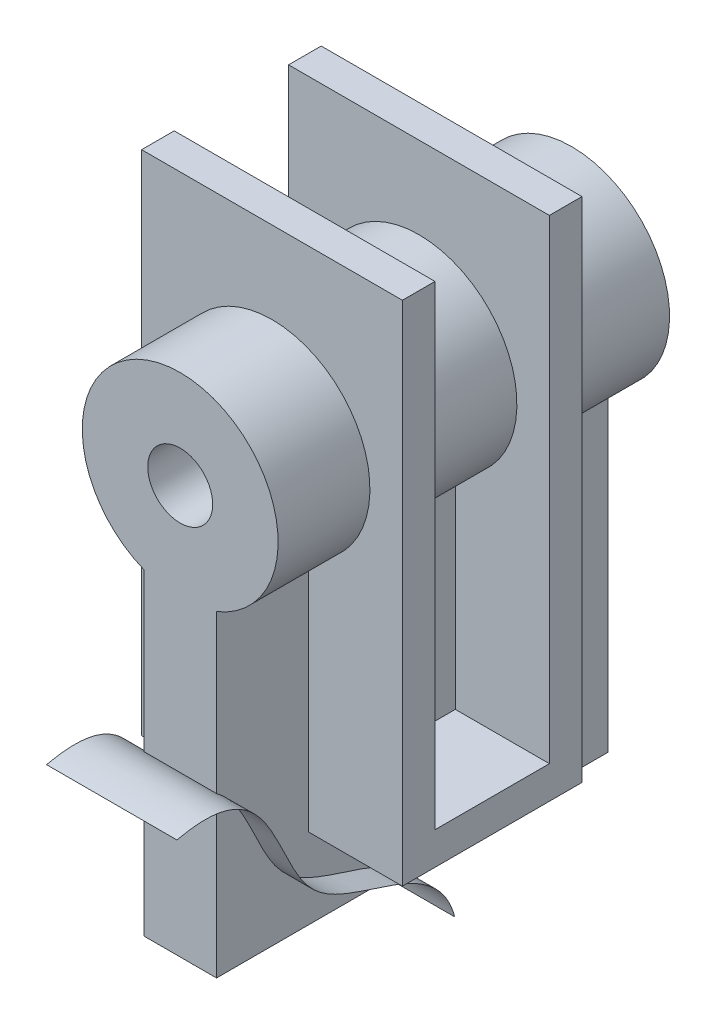
ISO-10303-21;
HEADER;
FILE_DESCRIPTION(('STEP AP214'),'2;1');
FILE_NAME('part.step','',(''),(''),'','','');
FILE_SCHEMA(('AUTOMOTIVE_DESIGN { 1 0 10303 214 1 1 1 1 }'));
ENDSEC;
DATA;
#1=APPLICATION_CONTEXT('core data for automotive mechanical design processes');
#2=APPLICATION_PROTOCOL_DEFINITION('international standard','automotive_design',2000,#1);
#3=PRODUCT_CONTEXT('',#1,'mechanical');
#4=PRODUCT('Part','Part','',(#3));
#5=PRODUCT_RELATED_PRODUCT_CATEGORY('part','',(#4));
#6=PRODUCT_DEFINITION_FORMATION('','',#4);
#7=PRODUCT_DEFINITION_CONTEXT('part definition',#1,'design');
#8=PRODUCT_DEFINITION('design','',#6,#7);
#9=PRODUCT_DEFINITION_SHAPE('','',#8);
#10=(LENGTH_UNIT() NAMED_UNIT(*) SI_UNIT(.MILLI.,.METRE.));
#11=(NAMED_UNIT(*) PLANE_ANGLE_UNIT() SI_UNIT($,.RADIAN.));
#12=(NAMED_UNIT(*) SI_UNIT($,.STERADIAN.) SOLID_ANGLE_UNIT());
#13=UNCERTAINTY_MEASURE_WITH_UNIT(LENGTH_MEASURE(1.E-05),#10,'distance_accuracy_value','');
#14=(GEOMETRIC_REPRESENTATION_CONTEXT(3) GLOBAL_UNCERTAINTY_ASSIGNED_CONTEXT((#13)) GLOBAL_UNIT_ASSIGNED_CONTEXT((#10,
#11,#12)) REPRESENTATION_CONTEXT('',''));
#15=CARTESIAN_POINT('',(0.,0.,0.));
#16=DIRECTION('',(0.,0.,1.));
#17=DIRECTION('',(1.,0.,0.));
#18=AXIS2_PLACEMENT_3D('',#15,#16,#17);
#19=CARTESIAN_POINT('',(0.,-36.8210870869659,40.5237731026121));
#20=CARTESIAN_POINT('',(0.,-33.3118553670702,25.1176072235687));
#21=CARTESIAN_POINT('',(0.,-61.7215890433346,26.7426652328646));
#22=CARTESIAN_POINT('',(0.,-57.8458147883083,0.702636395193637));
#23=CARTESIAN_POINT('',(0.,-68.3475748648418,-2.08737019533879));
#24=B_SPLINE_CURVE_WITH_KNOTS('',3,(#19,#20,#21,#22,#23),.UNSPECIFIED.,.F.,.F.,(4,1,4),(0.,
0.518621459530431,1.),.UNSPECIFIED.);
#25=DIRECTION('',(1.,0.,0.));
#26=VECTOR('',#25,1.);
#27=SURFACE_OF_LINEAR_EXTRUSION('',#24,#26);
#28=CARTESIAN_POINT('',(5.5776064521285,-36.8210870869659,40.5237731026121));
#29=CARTESIAN_POINT('',(5.5776064521285,-33.3118553670702,25.1176072235687));
#30=CARTESIAN_POINT('',(5.5776064521285,-61.7215890433346,26.7426652328646));
#31=CARTESIAN_POINT('',(5.5776064521285,-57.8458147883083,0.702636395193637));
#32=CARTESIAN_POINT('',(5.5776064521285,-68.3475748648418,-2.08737019533879));
#33=B_SPLINE_CURVE_WITH_KNOTS('',3,(#28,#29,#30,#31,#32),.UNSPECIFIED.,.F.,.F.,(4,1,4),(0.,
0.518621459530431,1.),.UNSPECIFIED.);
#34=CARTESIAN_POINT('',(5.5776064521285,-62.6622800075539,1.36688905202756));
#35=VERTEX_POINT('',#34);
#36=CARTESIAN_POINT('',(5.5776064521285,-38.1231716305938,30.02));
#37=VERTEX_POINT('',#36);
#38=EDGE_CURVE('E12',#35,#37,#33,.F.);
#39=ORIENTED_EDGE('',*,*,#38,.F.);
#40=DIRECTION('',(1.,0.,0.));
#41=VECTOR('',#40,1.);
#42=CARTESIAN_POINT('',(0.,-62.6622800075539,1.36688905202756));
#43=LINE('',#42,#41);
#44=CARTESIAN_POINT('',(-5.5776064521285,-62.6622800075539,1.36688904937728));
#45=VERTEX_POINT('',#44);
#46=EDGE_CURVE('E61',#45,#35,#43,.T.);
#47=ORIENTED_EDGE('',*,*,#46,.F.);
#48=CARTESIAN_POINT('',(-5.5776064521285,-36.8210870869659,40.5237731026121));
#49=CARTESIAN_POINT('',(-5.5776064521285,-33.3118553670702,25.1176072235687));
#50=CARTESIAN_POINT('',(-5.5776064521285,-61.7215890433346,26.7426652328646));
#51=CARTESIAN_POINT('',(-5.5776064521285,-57.8458147883083,0.702636395193637));
#52=CARTESIAN_POINT('',(-5.5776064521285,-68.3475748648418,-2.08737019533879));
#53=B_SPLINE_CURVE_WITH_KNOTS('',3,(#48,#49,#50,#51,#52),.UNSPECIFIED.,.F.,.F.,(4,1,4),(0.,
0.518621459530431,1.),.UNSPECIFIED.);
#54=CARTESIAN_POINT('',(-5.5776064521285,-38.1231716305938,30.02));
#55=VERTEX_POINT('',#54);
#56=EDGE_CURVE('E184',#55,#45,#53,.T.);
#57=ORIENTED_EDGE('',*,*,#56,.F.);
#58=DIRECTION('',(1.,0.,0.));
#59=VECTOR('',#58,1.);
#60=CARTESIAN_POINT('',(0.,-38.1231716305938,30.02));
#61=LINE('',#60,#59);
#62=EDGE_CURVE('E127',#37,#55,#61,.F.);
#63=ORIENTED_EDGE('',*,*,#62,.F.);
#64=EDGE_LOOP('',(#39,#47,#57,#63));
#65=FACE_BOUND('',#64,.T.);
#66=CARTESIAN_POINT('',(10.,-36.8210870869659,40.5237731026121));
#67=CARTESIAN_POINT('',(10.,-33.3118553670702,25.1176072235687));
#68=CARTESIAN_POINT('',(10.,-61.7215890433346,26.7426652328646));
#69=CARTESIAN_POINT('',(10.,-57.8458147883083,0.702636395193637));
#70=CARTESIAN_POINT('',(10.,-68.3475748648418,-2.08737019533879));
#71=B_SPLINE_CURVE_WITH_KNOTS('',3,(#66,#67,#68,#69,#70),.UNSPECIFIED.,.F.,.F.,(4,1,4),(0.,
0.518621459530431,1.),.UNSPECIFIED.);
#72=CARTESIAN_POINT('',(10.,-36.8210870869659,40.5237731026121));
#73=VERTEX_POINT('',#72);
#74=CARTESIAN_POINT('',(10.,-68.3475748648418,-2.08737019533879));
#75=VERTEX_POINT('',#74);
#76=EDGE_CURVE('E72',#73,#75,#71,.T.);
#77=ORIENTED_EDGE('',*,*,#76,.F.);
#78=DIRECTION('',(1.,0.,0.));
#79=VECTOR('',#78,1.);
#80=CARTESIAN_POINT('',(0.,-36.8210870869659,40.5237731026121));
#81=LINE('',#80,#79);
#82=CARTESIAN_POINT('',(-10.,-36.8210870869659,40.5237731026121));
#83=VERTEX_POINT('',#82);
#84=EDGE_CURVE('E173',#83,#73,#81,.T.);
#85=ORIENTED_EDGE('',*,*,#84,.F.);
#86=CARTESIAN_POINT('',(-10.,-36.8210870869659,40.5237731026121));
#87=CARTESIAN_POINT('',(-10.,-33.3118553670702,25.1176072235687));
#88=CARTESIAN_POINT('',(-10.,-61.7215890433346,26.7426652328646));
#89=CARTESIAN_POINT('',(-10.,-57.8458147883083,0.702636395193637));
#90=CARTESIAN_POINT('',(-10.,-68.3475748648418,-2.08737019533879));
#91=B_SPLINE_CURVE_WITH_KNOTS('',3,(#86,#87,#88,#89,#90),.UNSPECIFIED.,.F.,.F.,(4,1,4),(0.,
0.518621459530431,1.),.UNSPECIFIED.);
#92=CARTESIAN_POINT('',(-10.,-68.3475748648418,-2.08737019533879));
#93=VERTEX_POINT('',#92);
#94=EDGE_CURVE('E138',#83,#93,#91,.T.);
#95=ORIENTED_EDGE('',*,*,#94,.T.);
#96=DIRECTION('',(1.,0.,0.));
#97=VECTOR('',#96,1.);
#98=CARTESIAN_POINT('',(0.,-68.3475748648418,-2.08737019533879));
#99=LINE('',#98,#97);
#100=EDGE_CURVE('E174',#93,#75,#99,.T.);
#101=ORIENTED_EDGE('',*,*,#100,.T.);
#102=EDGE_LOOP('',(#77,#85,#95,#101));
#103=FACE_BOUND('',#102,.T.);
#104=ADVANCED_FACE('F53',(#65,#103),#27,.T.);
#105=CARTESIAN_POINT('',(0.,0.,-30.));
#106=DIRECTION('',(0.,0.,1.));
#107=DIRECTION('',(1.,0.,0.));
#108=AXIS2_PLACEMENT_3D('',#105,#106,#107);
#109=CYLINDRICAL_SURFACE('',#108,15.02);
#110=DIRECTION('',(0.,0.,1.));
#111=VECTOR('',#110,1.);
#112=CARTESIAN_POINT('',(-5.5776064521285,-13.9459924804646,-30.02));
#113=LINE('',#112,#111);
#114=CARTESIAN_POINT('',(-5.5776064521285,-13.9459924804646,-30.02));
#115=VERTEX_POINT('',#114);
#116=CARTESIAN_POINT('',(-5.5776064521285,-13.9459924804646,30.02));
#117=VERTEX_POINT('',#116);
#118=EDGE_CURVE('E109',#115,#117,#113,.T.);
#119=ORIENTED_EDGE('',*,*,#118,.F.);
#120=CARTESIAN_POINT('',(0.,0.,-30.02));
#121=DIRECTION('',(0.,0.,1.));
#122=DIRECTION('',(1.,0.,0.));
#123=AXIS2_PLACEMENT_3D('',#120,#121,#122);
#124=CIRCLE('',#123,15.02);
#125=CARTESIAN_POINT('',(5.5776064521285,-13.9459924804646,-30.02));
#126=VERTEX_POINT('',#125);
#127=EDGE_CURVE('E140',#126,#115,#124,.T.);
#128=ORIENTED_EDGE('',*,*,#127,.F.);
#129=DIRECTION('',(0.,0.,1.));
#130=VECTOR('',#129,1.);
#131=CARTESIAN_POINT('',(5.5776064521285,-13.9459924804646,-30.02));
#132=LINE('',#131,#130);
#133=CARTESIAN_POINT('',(5.5776064521285,-13.9459924804646,30.02));
#134=VERTEX_POINT('',#133);
#135=EDGE_CURVE('E131',#126,#134,#132,.T.);
#136=ORIENTED_EDGE('',*,*,#135,.T.);
#137=CARTESIAN_POINT('',(0.,0.,30.02));
#138=DIRECTION('',(0.,0.,1.));
#139=DIRECTION('',(1.,0.,0.));
#140=AXIS2_PLACEMENT_3D('',#137,#138,#139);
#141=CIRCLE('',#140,15.02);
#142=EDGE_CURVE('E125',#134,#117,#141,.T.);
#143=ORIENTED_EDGE('',*,*,#142,.T.);
#144=EDGE_LOOP('',(#119,#128,#136,#143));
#145=FACE_BOUND('',#144,.T.);
#146=ADVANCED_FACE('F130',(#145),#109,.F.);
#147=CARTESIAN_POINT('',(5.5776064521285,-13.9324445279089,-30.));
#148=DIRECTION('',(1.,0.,0.));
#149=DIRECTION('',(0.,1.,0.));
#150=AXIS2_PLACEMENT_3D('',#147,#148,#149);
#151=PLANE('',#150);
#152=ORIENTED_EDGE('',*,*,#38,.T.);
#153=DIRECTION('',(0.,1.,0.));
#154=VECTOR('',#153,1.);
#155=CARTESIAN_POINT('',(5.5776064521285,0.,30.02));
#156=LINE('',#155,#154);
#157=EDGE_CURVE('E68',#37,#134,#156,.T.);
#158=ORIENTED_EDGE('',*,*,#157,.T.);
#159=ORIENTED_EDGE('',*,*,#135,.F.);
#160=DIRECTION('',(0.,1.,0.));
#161=VECTOR('',#160,1.);
#162=CARTESIAN_POINT('',(5.5776064521285,0.,-30.02));
#163=LINE('',#162,#161);
#164=CARTESIAN_POINT('',(5.5776064521285,-62.6622800075539,-30.02));
#165=VERTEX_POINT('',#164);
#166=EDGE_CURVE('E121',#165,#126,#163,.T.);
#167=ORIENTED_EDGE('',*,*,#166,.F.);
#168=DIRECTION('',(0.,0.,1.));
#169=VECTOR('',#168,1.);
#170=CARTESIAN_POINT('',(5.5776064521285,-62.6622800075539,-30.));
#171=LINE('',#170,#169);
#172=EDGE_CURVE('E139',#165,#35,#171,.T.);
#173=ORIENTED_EDGE('',*,*,#172,.T.);
#174=EDGE_LOOP('',(#152,#158,#159,#167,#173));
#175=FACE_BOUND('',#174,.T.);
#176=ADVANCED_FACE('F198',(#175),#151,.F.);
#177=CARTESIAN_POINT('',(-5.5576064521285,-62.6622800075539,-30.));
#178=DIRECTION('',(0.,-1.,0.));
#179=DIRECTION('',(0.,0.,-1.));
#180=AXIS2_PLACEMENT_3D('',#177,#178,#179);
#181=PLANE('',#180);
#182=ORIENTED_EDGE('',*,*,#46,.T.);
#183=ORIENTED_EDGE('',*,*,#172,.F.);
#184=DIRECTION('',(1.,0.,0.));
#185=VECTOR('',#184,1.);
#186=CARTESIAN_POINT('',(0.,-62.6622800075539,-30.02));
#187=LINE('',#186,#185);
#188=CARTESIAN_POINT('',(-5.5776064521285,-62.6622800075539,-30.02));
#189=VERTEX_POINT('',#188);
#190=EDGE_CURVE('E148',#189,#165,#187,.T.);
#191=ORIENTED_EDGE('',*,*,#190,.F.);
#192=DIRECTION('',(0.,0.,1.));
#193=VECTOR('',#192,1.);
#194=CARTESIAN_POINT('',(-5.5776064521285,-62.6622800075539,-30.));
#195=LINE('',#194,#193);
#196=EDGE_CURVE('E120',#189,#45,#195,.T.);
#197=ORIENTED_EDGE('',*,*,#196,.T.);
#198=EDGE_LOOP('',(#182,#183,#191,#197));
#199=FACE_BOUND('',#198,.T.);
#200=ADVANCED_FACE('F192',(#199),#181,.F.);
#201=CARTESIAN_POINT('',(-5.5776064521285,-13.9324445279089,-30.));
#202=DIRECTION('',(-1.,0.,0.));
#203=DIRECTION('',(0.,0.,1.));
#204=AXIS2_PLACEMENT_3D('',#201,#202,#203);
#205=PLANE('',#204);
#206=ORIENTED_EDGE('',*,*,#56,.T.);
#207=ORIENTED_EDGE('',*,*,#196,.F.);
#208=DIRECTION('',(0.,-1.,0.));
#209=VECTOR('',#208,1.);
#210=CARTESIAN_POINT('',(-5.5776064521285,0.,-30.02));
#211=LINE('',#210,#209);
#212=EDGE_CURVE('E115',#115,#189,#211,.T.);
#213=ORIENTED_EDGE('',*,*,#212,.F.);
#214=ORIENTED_EDGE('',*,*,#118,.T.);
#215=DIRECTION('',(0.,-1.,0.));
#216=VECTOR('',#215,1.);
#217=CARTESIAN_POINT('',(-5.5776064521285,0.,30.02));
#218=LINE('',#217,#216);
#219=EDGE_CURVE('E112',#117,#55,#218,.T.);
#220=ORIENTED_EDGE('',*,*,#219,.T.);
#221=EDGE_LOOP('',(#206,#207,#213,#214,#220));
#222=FACE_BOUND('',#221,.T.);
#223=ADVANCED_FACE('F111',(#222),#205,.F.);
#224=CARTESIAN_POINT('',(0.,0.,-30.02));
#225=DIRECTION('',(0.,0.,1.));
#226=DIRECTION('',(1.,0.,0.));
#227=AXIS2_PLACEMENT_3D('',#224,#225,#226);
#228=PLANE('',#227);
#229=CARTESIAN_POINT('',(0.,0.,-30.02));
#230=DIRECTION('',(0.,0.,1.));
#231=DIRECTION('',(1.,0.,0.));
#232=AXIS2_PLACEMENT_3D('',#229,#230,#231);
#233=CIRCLE('',#232,4.98);
#234=CARTESIAN_POINT('',(4.98,0.,-30.02));
#235=VERTEX_POINT('',#234);
#236=EDGE_CURVE('E142',#235,#235,#233,.T.);
#237=ORIENTED_EDGE('',*,*,#236,.F.);
#238=EDGE_LOOP('',(#237));
#239=FACE_BOUND('',#238,.T.);
#240=ORIENTED_EDGE('',*,*,#127,.T.);
#241=ORIENTED_EDGE('',*,*,#212,.T.);
#242=ORIENTED_EDGE('',*,*,#190,.T.);
#243=ORIENTED_EDGE('',*,*,#166,.T.);
#244=EDGE_LOOP('',(#240,#241,#242,#243));
#245=FACE_BOUND('',#244,.T.);
#246=ADVANCED_FACE('F201',(#239,#245),#228,.T.);
#247=CARTESIAN_POINT('',(0.,0.,-30.));
#248=DIRECTION('',(0.,0.,1.));
#249=DIRECTION('',(1.,0.,0.));
#250=AXIS2_PLACEMENT_3D('',#247,#248,#249);
#251=CYLINDRICAL_SURFACE('',#250,4.98);
#252=ORIENTED_EDGE('',*,*,#236,.T.);
#253=EDGE_LOOP('',(#252));
#254=FACE_BOUND('',#253,.T.);
#255=CARTESIAN_POINT('',(0.,0.,30.02));
#256=DIRECTION('',(0.,0.,1.));
#257=DIRECTION('',(1.,0.,0.));
#258=AXIS2_PLACEMENT_3D('',#255,#256,#257);
#259=CIRCLE('',#258,4.98);
#260=CARTESIAN_POINT('',(4.98,0.,30.02));
#261=VERTEX_POINT('',#260);
#262=EDGE_CURVE('E132',#261,#261,#259,.T.);
#263=ORIENTED_EDGE('',*,*,#262,.F.);
#264=EDGE_LOOP('',(#263));
#265=FACE_BOUND('',#264,.T.);
#266=ADVANCED_FACE('F203',(#254,#265),#251,.T.);
#267=CARTESIAN_POINT('',(0.,0.,30.02));
#268=DIRECTION('',(0.,0.,1.));
#269=DIRECTION('',(1.,0.,0.));
#270=AXIS2_PLACEMENT_3D('',#267,#268,#269);
#271=PLANE('',#270);
#272=ORIENTED_EDGE('',*,*,#62,.T.);
#273=ORIENTED_EDGE('',*,*,#219,.F.);
#274=ORIENTED_EDGE('',*,*,#142,.F.);
#275=ORIENTED_EDGE('',*,*,#157,.F.);
#276=EDGE_LOOP('',(#272,#273,#274,#275));
#277=FACE_BOUND('',#276,.T.);
#278=ORIENTED_EDGE('',*,*,#262,.T.);
#279=EDGE_LOOP('',(#278));
#280=FACE_BOUND('',#279,.T.);
#281=ADVANCED_FACE('F123',(#277,#280),#271,.F.);
#282=OPEN_SHELL('',(#104,#146,#176,#200,#223,#246,#266,#281));
#283=SHELL_BASED_SURFACE_MODEL('B2',(#282));
#284=CARTESIAN_POINT('',(-20.,-45.2531458099855,-6.6055019568257));
#285=DIRECTION('',(0.,1.,0.));
#286=DIRECTION('',(0.,0.,1.));
#287=AXIS2_PLACEMENT_3D('',#284,#285,#286);
#288=PLANE('',#287);
#289=DIRECTION('',(1.,0.,0.));
#290=VECTOR('',#289,1.);
#291=CARTESIAN_POINT('',(-20.,-45.2531458099855,10.9381302617935));
#292=LINE('',#291,#290);
#293=CARTESIAN_POINT('',(-20.,-45.2531458099855,10.9381302617935));
#294=VERTEX_POINT('',#293);
#295=CARTESIAN_POINT('',(20.,-45.2531458099855,10.9381302617935));
#296=VERTEX_POINT('',#295);
#297=EDGE_CURVE('E319',#294,#296,#292,.T.);
#298=ORIENTED_EDGE('',*,*,#297,.T.);
#299=DIRECTION('',(0.,0.,1.));
#300=VECTOR('',#299,1.);
#301=CARTESIAN_POINT('',(20.,-45.2531458099855,-6.6055019568257));
#302=LINE('',#301,#300);
#303=CARTESIAN_POINT('',(20.,-45.2531458099855,-6.6055019568257));
#304=VERTEX_POINT('',#303);
#305=EDGE_CURVE('E380',#304,#296,#302,.T.);
#306=ORIENTED_EDGE('',*,*,#305,.F.);
#307=DIRECTION('',(1.,0.,0.));
#308=VECTOR('',#307,1.);
#309=CARTESIAN_POINT('',(-20.,-45.2531458099855,-6.6055019568257));
#310=LINE('',#309,#308);
#311=CARTESIAN_POINT('',(-20.,-45.2531458099855,-6.6055019568257));
#312=VERTEX_POINT('',#311);
#313=EDGE_CURVE('E51',#312,#304,#310,.T.);
#314=ORIENTED_EDGE('',*,*,#313,.F.);
#315=DIRECTION('',(0.,0.,1.));
#316=VECTOR('',#315,1.);
#317=CARTESIAN_POINT('',(-20.,-45.2531458099855,-6.6055019568257));
#318=LINE('',#317,#316);
#319=EDGE_CURVE('E381',#312,#294,#318,.T.);
#320=ORIENTED_EDGE('',*,*,#319,.T.);
#321=EDGE_LOOP('',(#298,#306,#314,#320));
#322=FACE_BOUND('',#321,.T.);
#323=ADVANCED_FACE('F316',(#322),#288,.T.);
#324=CARTESIAN_POINT('',(-20.,-45.2531458099855,-6.6055019568257));
#325=DIRECTION('',(0.,0.,1.));
#326=DIRECTION('',(1.,0.,0.));
#327=AXIS2_PLACEMENT_3D('',#324,#325,#326);
#328=PLANE('',#327);
#329=ORIENTED_EDGE('',*,*,#313,.T.);
#330=DIRECTION('',(0.,-1.,0.));
#331=VECTOR('',#330,1.);
#332=CARTESIAN_POINT('',(20.,-45.2531458099855,-6.6055019568257));
#333=LINE('',#332,#331);
#334=CARTESIAN_POINT('',(20.,27.5804653060911,-6.6055019568257));
#335=VERTEX_POINT('',#334);
#336=EDGE_CURVE('E398',#335,#304,#333,.T.);
#337=ORIENTED_EDGE('',*,*,#336,.F.);
#338=DIRECTION('',(1.,0.,0.));
#339=VECTOR('',#338,1.);
#340=CARTESIAN_POINT('',(-20.,27.5804653060911,-6.6055019568257));
#341=LINE('',#340,#339);
#342=CARTESIAN_POINT('',(-20.,27.5804653060911,-6.6055019568257));
#343=VERTEX_POINT('',#342);
#344=EDGE_CURVE('E324',#343,#335,#341,.T.);
#345=ORIENTED_EDGE('',*,*,#344,.F.);
#346=DIRECTION('',(0.,-1.,0.));
#347=VECTOR('',#346,1.);
#348=CARTESIAN_POINT('',(-20.,-45.2531458099855,-6.6055019568257));
#349=LINE('',#348,#347);
#350=EDGE_CURVE('E386',#343,#312,#349,.T.);
#351=ORIENTED_EDGE('',*,*,#350,.T.);
#352=EDGE_LOOP('',(#329,#337,#345,#351));
#353=FACE_BOUND('',#352,.T.);
#354=ADVANCED_FACE('F462',(#353),#328,.T.);
#355=CARTESIAN_POINT('',(-20.,27.5804653060911,-6.6055019568257));
#356=DIRECTION('',(0.,1.,0.));
#357=DIRECTION('',(0.,0.,1.));
#358=AXIS2_PLACEMENT_3D('',#355,#356,#357);
#359=PLANE('',#358);
#360=ORIENTED_EDGE('',*,*,#344,.T.);
#361=DIRECTION('',(0.,0.,1.));
#362=VECTOR('',#361,1.);
#363=CARTESIAN_POINT('',(20.,27.5804653060911,-6.6055019568257));
#364=LINE('',#363,#362);
#365=CARTESIAN_POINT('',(20.,27.5804653060911,-11.6055019568257));
#366=VERTEX_POINT('',#365);
#367=EDGE_CURVE('E411',#366,#335,#364,.T.);
#368=ORIENTED_EDGE('',*,*,#367,.F.);
#369=DIRECTION('',(1.,0.,0.));
#370=VECTOR('',#369,1.);
#371=CARTESIAN_POINT('',(-20.,27.5804653060911,-11.6055019568257));
#372=LINE('',#371,#370);
#373=CARTESIAN_POINT('',(-20.,27.5804653060911,-11.6055019568257));
#374=VERTEX_POINT('',#373);
#375=EDGE_CURVE('E433',#374,#366,#372,.T.);
#376=ORIENTED_EDGE('',*,*,#375,.F.);
#377=DIRECTION('',(0.,0.,1.));
#378=VECTOR('',#377,1.);
#379=CARTESIAN_POINT('',(-20.,27.5804653060911,-6.6055019568257));
#380=LINE('',#379,#378);
#381=EDGE_CURVE('E429',#374,#343,#380,.T.);
#382=ORIENTED_EDGE('',*,*,#381,.T.);
#383=EDGE_LOOP('',(#360,#368,#376,#382));
#384=FACE_BOUND('',#383,.T.);
#385=ADVANCED_FACE('F461',(#384),#359,.T.);
#386=CARTESIAN_POINT('',(-20.,-50.2531458099855,-11.6055019568257));
#387=DIRECTION('',(0.,0.,-1.));
#388=DIRECTION('',(-1.,0.,0.));
#389=AXIS2_PLACEMENT_3D('',#386,#387,#388);
#390=PLANE('',#389);
#391=ORIENTED_EDGE('',*,*,#375,.T.);
#392=DIRECTION('',(0.,1.,0.));
#393=VECTOR('',#392,1.);
#394=CARTESIAN_POINT('',(20.,-50.2531458099855,-11.6055019568257));
#395=LINE('',#394,#393);
#396=CARTESIAN_POINT('',(20.,-50.2531458099855,-11.6055019568257));
#397=VERTEX_POINT('',#396);
#398=EDGE_CURVE('E408',#397,#366,#395,.T.);
#399=ORIENTED_EDGE('',*,*,#398,.F.);
#400=DIRECTION('',(1.,0.,0.));
#401=VECTOR('',#400,1.);
#402=CARTESIAN_POINT('',(-20.,-50.2531458099855,-11.6055019568257));
#403=LINE('',#402,#401);
#404=CARTESIAN_POINT('',(-20.,-50.2531458099855,-11.6055019568257));
#405=VERTEX_POINT('',#404);
#406=EDGE_CURVE('E435',#405,#397,#403,.T.);
#407=ORIENTED_EDGE('',*,*,#406,.F.);
#408=DIRECTION('',(0.,1.,0.));
#409=VECTOR('',#408,1.);
#410=CARTESIAN_POINT('',(-20.,-50.2531458099855,-11.6055019568257));
#411=LINE('',#410,#409);
#412=EDGE_CURVE('E426',#405,#374,#411,.T.);
#413=ORIENTED_EDGE('',*,*,#412,.T.);
#414=EDGE_LOOP('',(#391,#399,#407,#413));
#415=FACE_BOUND('',#414,.T.);
#416=ADVANCED_FACE('F457',(#415),#390,.T.);
#417=CARTESIAN_POINT('',(-20.,-50.2531458099855,-11.6055019568257));
#418=DIRECTION('',(0.,-1.,0.));
#419=DIRECTION('',(0.,0.,-1.));
#420=AXIS2_PLACEMENT_3D('',#417,#418,#419);
#421=PLANE('',#420);
#422=ORIENTED_EDGE('',*,*,#406,.T.);
#423=DIRECTION('',(0.,0.,-1.));
#424=VECTOR('',#423,1.);
#425=CARTESIAN_POINT('',(20.,-50.2531458099855,-11.6055019568257));
#426=LINE('',#425,#424);
#427=CARTESIAN_POINT('',(20.,-50.2531458099855,15.9381302617935));
#428=VERTEX_POINT('',#427);
#429=EDGE_CURVE('E405',#428,#397,#426,.T.);
#430=ORIENTED_EDGE('',*,*,#429,.F.);
#431=DIRECTION('',(1.,0.,0.));
#432=VECTOR('',#431,1.);
#433=CARTESIAN_POINT('',(-20.,-50.2531458099855,15.9381302617935));
#434=LINE('',#433,#432);
#435=CARTESIAN_POINT('',(-20.,-50.2531458099855,15.9381302617935));
#436=VERTEX_POINT('',#435);
#437=EDGE_CURVE('E437',#436,#428,#434,.T.);
#438=ORIENTED_EDGE('',*,*,#437,.F.);
#439=DIRECTION('',(0.,0.,-1.));
#440=VECTOR('',#439,1.);
#441=CARTESIAN_POINT('',(-20.,-50.2531458099855,-11.6055019568257));
#442=LINE('',#441,#440);
#443=EDGE_CURVE('E423',#436,#405,#442,.T.);
#444=ORIENTED_EDGE('',*,*,#443,.T.);
#445=EDGE_LOOP('',(#422,#430,#438,#444));
#446=FACE_BOUND('',#445,.T.);
#447=ADVANCED_FACE('F450',(#446),#421,.T.);
#448=CARTESIAN_POINT('',(-20.,-50.2531458099855,15.9381302617935));
#449=DIRECTION('',(0.,0.,1.));
#450=DIRECTION('',(1.,0.,0.));
#451=AXIS2_PLACEMENT_3D('',#448,#449,#450);
#452=PLANE('',#451);
#453=ORIENTED_EDGE('',*,*,#437,.T.);
#454=DIRECTION('',(0.,-1.,0.));
#455=VECTOR('',#454,1.);
#456=CARTESIAN_POINT('',(20.,-50.2531458099855,15.9381302617935));
#457=LINE('',#456,#455);
#458=CARTESIAN_POINT('',(20.,27.5804653060911,15.9381302617935));
#459=VERTEX_POINT('',#458);
#460=EDGE_CURVE('E402',#459,#428,#457,.T.);
#461=ORIENTED_EDGE('',*,*,#460,.F.);
#462=DIRECTION('',(1.,0.,0.));
#463=VECTOR('',#462,1.);
#464=CARTESIAN_POINT('',(-20.,27.5804653060911,15.9381302617935));
#465=LINE('',#464,#463);
#466=CARTESIAN_POINT('',(-20.,27.5804653060911,15.9381302617935));
#467=VERTEX_POINT('',#466);
#468=EDGE_CURVE('E439',#467,#459,#465,.T.);
#469=ORIENTED_EDGE('',*,*,#468,.F.);
#470=DIRECTION('',(0.,-1.,0.));
#471=VECTOR('',#470,1.);
#472=CARTESIAN_POINT('',(-20.,-50.2531458099855,15.9381302617935));
#473=LINE('',#472,#471);
#474=EDGE_CURVE('E420',#467,#436,#473,.T.);
#475=ORIENTED_EDGE('',*,*,#474,.T.);
#476=EDGE_LOOP('',(#453,#461,#469,#475));
#477=FACE_BOUND('',#476,.T.);
#478=ADVANCED_FACE('F447',(#477),#452,.T.);
#479=CARTESIAN_POINT('',(-20.,27.5804653060911,15.9381302617935));
#480=DIRECTION('',(0.,1.,0.));
#481=DIRECTION('',(0.,0.,1.));
#482=AXIS2_PLACEMENT_3D('',#479,#480,#481);
#483=PLANE('',#482);
#484=ORIENTED_EDGE('',*,*,#468,.T.);
#485=DIRECTION('',(0.,0.,1.));
#486=VECTOR('',#485,1.);
#487=CARTESIAN_POINT('',(20.,27.5804653060911,15.9381302617935));
#488=LINE('',#487,#486);
#489=CARTESIAN_POINT('',(20.,27.5804653060911,10.9381302617935));
#490=VERTEX_POINT('',#489);
#491=EDGE_CURVE('E393',#490,#459,#488,.T.);
#492=ORIENTED_EDGE('',*,*,#491,.F.);
#493=DIRECTION('',(1.,0.,0.));
#494=VECTOR('',#493,1.);
#495=CARTESIAN_POINT('',(-20.,27.5804653060911,10.9381302617935));
#496=LINE('',#495,#494);
#497=CARTESIAN_POINT('',(-20.,27.5804653060911,10.9381302617935));
#498=VERTEX_POINT('',#497);
#499=EDGE_CURVE('E385',#498,#490,#496,.T.);
#500=ORIENTED_EDGE('',*,*,#499,.F.);
#501=DIRECTION('',(0.,0.,1.));
#502=VECTOR('',#501,1.);
#503=CARTESIAN_POINT('',(-20.,27.5804653060911,15.9381302617935));
#504=LINE('',#503,#502);
#505=EDGE_CURVE('E417',#498,#467,#504,.T.);
#506=ORIENTED_EDGE('',*,*,#505,.T.);
#507=EDGE_LOOP('',(#484,#492,#500,#506));
#508=FACE_BOUND('',#507,.T.);
#509=ADVANCED_FACE('F441',(#508),#483,.T.);
#510=CARTESIAN_POINT('',(-20.,-45.2531458099855,10.9381302617935));
#511=DIRECTION('',(0.,0.,-1.));
#512=DIRECTION('',(-1.,0.,0.));
#513=AXIS2_PLACEMENT_3D('',#510,#511,#512);
#514=PLANE('',#513);
#515=ORIENTED_EDGE('',*,*,#499,.T.);
#516=DIRECTION('',(0.,1.,0.));
#517=VECTOR('',#516,1.);
#518=CARTESIAN_POINT('',(20.,-45.2531458099855,10.9381302617935));
#519=LINE('',#518,#517);
#520=EDGE_CURVE('E388',#296,#490,#519,.T.);
#521=ORIENTED_EDGE('',*,*,#520,.F.);
#522=ORIENTED_EDGE('',*,*,#297,.F.);
#523=DIRECTION('',(0.,1.,0.));
#524=VECTOR('',#523,1.);
#525=CARTESIAN_POINT('',(-20.,-45.2531458099855,10.9381302617935));
#526=LINE('',#525,#524);
#527=EDGE_CURVE('E415',#294,#498,#526,.T.);
#528=ORIENTED_EDGE('',*,*,#527,.T.);
#529=EDGE_LOOP('',(#515,#521,#522,#528));
#530=FACE_BOUND('',#529,.T.);
#531=ADVANCED_FACE('F389',(#530),#514,.T.);
#532=CARTESIAN_POINT('',(-20.,0.,-70.));
#533=DIRECTION('',(-1.,0.,0.));
#534=DIRECTION('',(0.,0.,1.));
#535=AXIS2_PLACEMENT_3D('',#532,#533,#534);
#536=PLANE('',#535);
#537=ORIENTED_EDGE('',*,*,#319,.F.);
#538=ORIENTED_EDGE('',*,*,#350,.F.);
#539=ORIENTED_EDGE('',*,*,#381,.F.);
#540=ORIENTED_EDGE('',*,*,#412,.F.);
#541=ORIENTED_EDGE('',*,*,#443,.F.);
#542=ORIENTED_EDGE('',*,*,#474,.F.);
#543=ORIENTED_EDGE('',*,*,#505,.F.);
#544=ORIENTED_EDGE('',*,*,#527,.F.);
#545=EDGE_LOOP('',(#537,#538,#539,#540,#541,#542,#543,#544));
#546=FACE_BOUND('',#545,.T.);
#547=ADVANCED_FACE('F453',(#546),#536,.T.);
#548=CARTESIAN_POINT('',(20.,0.,-70.));
#549=DIRECTION('',(-1.,0.,0.));
#550=DIRECTION('',(0.,0.,1.));
#551=AXIS2_PLACEMENT_3D('',#548,#549,#550);
#552=PLANE('',#551);
#553=ORIENTED_EDGE('',*,*,#305,.T.);
#554=ORIENTED_EDGE('',*,*,#520,.T.);
#555=ORIENTED_EDGE('',*,*,#491,.T.);
#556=ORIENTED_EDGE('',*,*,#460,.T.);
#557=ORIENTED_EDGE('',*,*,#429,.T.);
#558=ORIENTED_EDGE('',*,*,#398,.T.);
#559=ORIENTED_EDGE('',*,*,#367,.T.);
#560=ORIENTED_EDGE('',*,*,#336,.T.);
#561=EDGE_LOOP('',(#553,#554,#555,#556,#557,#558,#559,#560));
#562=FACE_BOUND('',#561,.T.);
#563=ADVANCED_FACE('F396',(#562),#552,.F.);
#564=CLOSED_SHELL('',(#323,#354,#385,#416,#447,#478,#509,#531,#547,#563));
#565=MANIFOLD_SOLID_BREP('B6',#564);
#566=CARTESIAN_POINT('',(0.,0.,-30.));
#567=DIRECTION('',(0.,0.,1.));
#568=DIRECTION('',(1.,0.,0.));
#569=AXIS2_PLACEMENT_3D('',#566,#567,#568);
#570=CYLINDRICAL_SURFACE('',#569,15.);
#571=DIRECTION('',(0.,0.,1.));
#572=VECTOR('',#571,1.);
#573=CARTESIAN_POINT('',(-5.5576064521285,-13.9324445279089,-30.));
#574=LINE('',#573,#572);
#575=CARTESIAN_POINT('',(-5.5576064521285,-13.9324445279089,-30.));
#576=VERTEX_POINT('',#575);
#577=CARTESIAN_POINT('',(-5.5576064521285,-13.9324445279089,30.));
#578=VERTEX_POINT('',#577);
#579=EDGE_CURVE('E546',#576,#578,#574,.T.);
#580=ORIENTED_EDGE('',*,*,#579,.T.);
#581=CARTESIAN_POINT('',(0.,0.,30.));
#582=DIRECTION('',(0.,0.,1.));
#583=DIRECTION('',(1.,0.,0.));
#584=AXIS2_PLACEMENT_3D('',#581,#582,#583);
#585=CIRCLE('',#584,15.);
#586=CARTESIAN_POINT('',(5.5576064521285,-13.9324445279089,30.));
#587=VERTEX_POINT('',#586);
#588=EDGE_CURVE('E583',#587,#578,#585,.T.);
#589=ORIENTED_EDGE('',*,*,#588,.F.);
#590=DIRECTION('',(0.,0.,1.));
#591=VECTOR('',#590,1.);
#592=CARTESIAN_POINT('',(5.5576064521285,-13.9324445279089,-30.));
#593=LINE('',#592,#591);
#594=CARTESIAN_POINT('',(5.5576064521285,-13.9324445279089,-30.));
#595=VERTEX_POINT('',#594);
#596=EDGE_CURVE('E314',#595,#587,#593,.T.);
#597=ORIENTED_EDGE('',*,*,#596,.F.);
#598=CARTESIAN_POINT('',(0.,0.,-30.));
#599=DIRECTION('',(0.,0.,1.));
#600=DIRECTION('',(1.,0.,0.));
#601=AXIS2_PLACEMENT_3D('',#598,#599,#600);
#602=CIRCLE('',#601,15.);
#603=EDGE_CURVE('E584',#595,#576,#602,.T.);
#604=ORIENTED_EDGE('',*,*,#603,.T.);
#605=EDGE_LOOP('',(#580,#589,#597,#604));
#606=FACE_BOUND('',#605,.T.);
#607=ADVANCED_FACE('F543',(#606),#570,.T.);
#608=CARTESIAN_POINT('',(5.5576064521285,-13.9324445279089,-30.));
#609=DIRECTION('',(1.,0.,0.));
#610=DIRECTION('',(0.,1.,0.));
#611=AXIS2_PLACEMENT_3D('',#608,#609,#610);
#612=PLANE('',#611);
#613=ORIENTED_EDGE('',*,*,#596,.T.);
#614=DIRECTION('',(0.,1.,0.));
#615=VECTOR('',#614,1.);
#616=CARTESIAN_POINT('',(5.5576064521285,-13.9324445279089,30.));
#617=LINE('',#616,#615);
#618=CARTESIAN_POINT('',(5.5576064521285,-62.6422800075539,30.));
#619=VERTEX_POINT('',#618);
#620=EDGE_CURVE('E601',#619,#587,#617,.T.);
#621=ORIENTED_EDGE('',*,*,#620,.F.);
#622=DIRECTION('',(0.,0.,1.));
#623=VECTOR('',#622,1.);
#624=CARTESIAN_POINT('',(5.5576064521285,-62.6422800075539,-30.));
#625=LINE('',#624,#623);
#626=CARTESIAN_POINT('',(5.5576064521285,-62.6422800075539,-30.));
#627=VERTEX_POINT('',#626);
#628=EDGE_CURVE('E551',#627,#619,#625,.T.);
#629=ORIENTED_EDGE('',*,*,#628,.F.);
#630=DIRECTION('',(0.,1.,0.));
#631=VECTOR('',#630,1.);
#632=CARTESIAN_POINT('',(5.5576064521285,-13.9324445279089,-30.));
#633=LINE('',#632,#631);
#634=EDGE_CURVE('E589',#627,#595,#633,.T.);
#635=ORIENTED_EDGE('',*,*,#634,.T.);
#636=EDGE_LOOP('',(#613,#621,#629,#635));
#637=FACE_BOUND('',#636,.T.);
#638=ADVANCED_FACE('F622',(#637),#612,.T.);
#639=CARTESIAN_POINT('',(-5.5576064521285,-62.6422800075539,-30.));
#640=DIRECTION('',(0.,-1.,0.));
#641=DIRECTION('',(0.,0.,-1.));
#642=AXIS2_PLACEMENT_3D('',#639,#640,#641);
#643=PLANE('',#642);
#644=ORIENTED_EDGE('',*,*,#628,.T.);
#645=DIRECTION('',(1.,0.,0.));
#646=VECTOR('',#645,1.);
#647=CARTESIAN_POINT('',(-5.5576064521285,-62.6422800075539,30.));
#648=LINE('',#647,#646);
#649=CARTESIAN_POINT('',(-5.5576064521285,-62.6422800075539,30.));
#650=VERTEX_POINT('',#649);
#651=EDGE_CURVE('E596',#650,#619,#648,.T.);
#652=ORIENTED_EDGE('',*,*,#651,.F.);
#653=DIRECTION('',(0.,0.,1.));
#654=VECTOR('',#653,1.);
#655=CARTESIAN_POINT('',(-5.5576064521285,-62.6422800075539,-30.));
#656=LINE('',#655,#654);
#657=CARTESIAN_POINT('',(-5.5576064521285,-62.6422800075539,-30.));
#658=VERTEX_POINT('',#657);
#659=EDGE_CURVE('E588',#658,#650,#656,.T.);
#660=ORIENTED_EDGE('',*,*,#659,.F.);
#661=DIRECTION('',(1.,0.,0.));
#662=VECTOR('',#661,1.);
#663=CARTESIAN_POINT('',(-5.5576064521285,-62.6422800075539,-30.));
#664=LINE('',#663,#662);
#665=EDGE_CURVE('E615',#658,#627,#664,.T.);
#666=ORIENTED_EDGE('',*,*,#665,.T.);
#667=EDGE_LOOP('',(#644,#652,#660,#666));
#668=FACE_BOUND('',#667,.T.);
#669=ADVANCED_FACE('F619',(#668),#643,.T.);
#670=CARTESIAN_POINT('',(-5.5576064521285,-13.9324445279089,-30.));
#671=DIRECTION('',(-1.,0.,0.));
#672=DIRECTION('',(0.,0.,1.));
#673=AXIS2_PLACEMENT_3D('',#670,#671,#672);
#674=PLANE('',#673);
#675=ORIENTED_EDGE('',*,*,#659,.T.);
#676=DIRECTION('',(0.,-1.,0.));
#677=VECTOR('',#676,1.);
#678=CARTESIAN_POINT('',(-5.5576064521285,-13.9324445279089,30.));
#679=LINE('',#678,#677);
#680=EDGE_CURVE('E591',#578,#650,#679,.T.);
#681=ORIENTED_EDGE('',*,*,#680,.F.);
#682=ORIENTED_EDGE('',*,*,#579,.F.);
#683=DIRECTION('',(0.,-1.,0.));
#684=VECTOR('',#683,1.);
#685=CARTESIAN_POINT('',(-5.5576064521285,-13.9324445279089,-30.));
#686=LINE('',#685,#684);
#687=EDGE_CURVE('E613',#576,#658,#686,.T.);
#688=ORIENTED_EDGE('',*,*,#687,.T.);
#689=EDGE_LOOP('',(#675,#681,#682,#688));
#690=FACE_BOUND('',#689,.T.);
#691=ADVANCED_FACE('F592',(#690),#674,.T.);
#692=CARTESIAN_POINT('',(0.,0.,-30.));
#693=DIRECTION('',(0.,0.,1.));
#694=DIRECTION('',(1.,0.,0.));
#695=AXIS2_PLACEMENT_3D('',#692,#693,#694);
#696=PLANE('',#695);
#697=CARTESIAN_POINT('',(0.,0.,-30.));
#698=DIRECTION('',(0.,0.,1.));
#699=DIRECTION('',(1.,0.,0.));
#700=AXIS2_PLACEMENT_3D('',#697,#698,#699);
#701=CIRCLE('',#700,5.);
#702=CARTESIAN_POINT('',(5.,0.,-30.));
#703=VERTEX_POINT('',#702);
#704=EDGE_CURVE('E609',#703,#703,#701,.T.);
#705=ORIENTED_EDGE('',*,*,#704,.T.);
#706=EDGE_LOOP('',(#705));
#707=FACE_BOUND('',#706,.T.);
#708=ORIENTED_EDGE('',*,*,#603,.F.);
#709=ORIENTED_EDGE('',*,*,#634,.F.);
#710=ORIENTED_EDGE('',*,*,#665,.F.);
#711=ORIENTED_EDGE('',*,*,#687,.F.);
#712=EDGE_LOOP('',(#708,#709,#710,#711));
#713=FACE_BOUND('',#712,.T.);
#714=ADVANCED_FACE('F624',(#707,#713),#696,.F.);
#715=CARTESIAN_POINT('',(0.,0.,-30.));
#716=DIRECTION('',(0.,0.,1.));
#717=DIRECTION('',(1.,0.,0.));
#718=AXIS2_PLACEMENT_3D('',#715,#716,#717);
#719=CYLINDRICAL_SURFACE('',#718,5.);
#720=ORIENTED_EDGE('',*,*,#704,.F.);
#721=EDGE_LOOP('',(#720));
#722=FACE_BOUND('',#721,.T.);
#723=CARTESIAN_POINT('',(0.,0.,30.));
#724=DIRECTION('',(0.,0.,1.));
#725=DIRECTION('',(1.,0.,0.));
#726=AXIS2_PLACEMENT_3D('',#723,#724,#725);
#727=CIRCLE('',#726,5.);
#728=CARTESIAN_POINT('',(5.,0.,30.));
#729=VERTEX_POINT('',#728);
#730=EDGE_CURVE('E602',#729,#729,#727,.T.);
#731=ORIENTED_EDGE('',*,*,#730,.T.);
#732=EDGE_LOOP('',(#731));
#733=FACE_BOUND('',#732,.T.);
#734=ADVANCED_FACE('F626',(#722,#733),#719,.F.);
#735=CARTESIAN_POINT('',(0.,0.,30.));
#736=DIRECTION('',(0.,0.,1.));
#737=DIRECTION('',(1.,0.,0.));
#738=AXIS2_PLACEMENT_3D('',#735,#736,#737);
#739=PLANE('',#738);
#740=ORIENTED_EDGE('',*,*,#588,.T.);
#741=ORIENTED_EDGE('',*,*,#680,.T.);
#742=ORIENTED_EDGE('',*,*,#651,.T.);
#743=ORIENTED_EDGE('',*,*,#620,.T.);
#744=EDGE_LOOP('',(#740,#741,#742,#743));
#745=FACE_BOUND('',#744,.T.);
#746=ORIENTED_EDGE('',*,*,#730,.F.);
#747=EDGE_LOOP('',(#746));
#748=FACE_BOUND('',#747,.T.);
#749=ADVANCED_FACE('F599',(#745,#748),#739,.T.);
#750=CLOSED_SHELL('',(#607,#638,#669,#691,#714,#734,#749));
#751=MANIFOLD_SOLID_BREP('B45',#750);
#752=ADVANCED_BREP_SHAPE_REPRESENTATION('',(#18,#565,#751),#14);
#753=MANIFOLD_SURFACE_SHAPE_REPRESENTATION('',(#18,#283),#14);
#754=SHAPE_REPRESENTATION('',(#18),#14);
#755=SHAPE_DEFINITION_REPRESENTATION(#9,#754);
#756=SHAPE_REPRESENTATION_RELATIONSHIP('','',#754,#752);
#757=SHAPE_REPRESENTATION_RELATIONSHIP('','',#754,#753);
ENDSEC;
END-ISO-10303-21;
